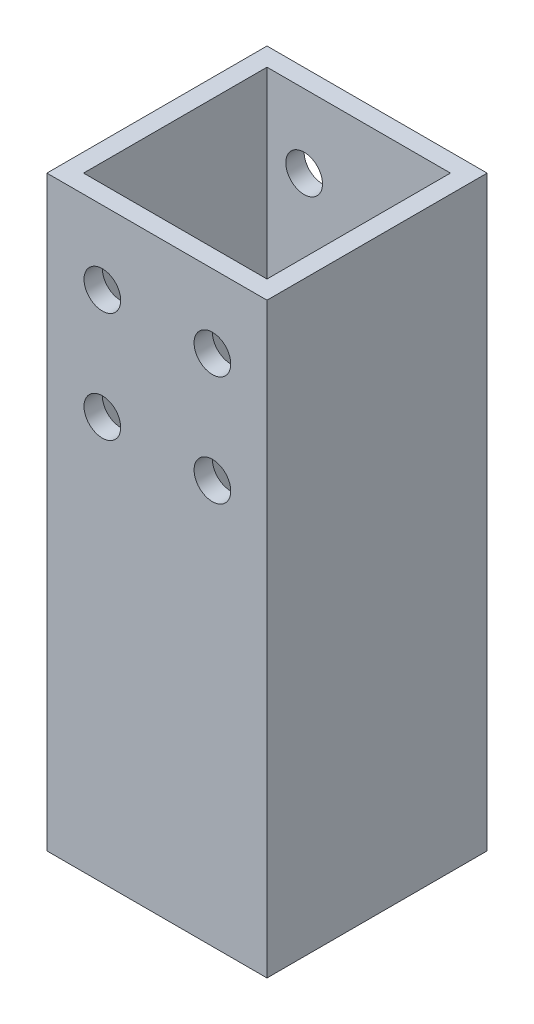
ISO-10303-21;
HEADER;
FILE_DESCRIPTION(('STEP AP214'),'2;1');
FILE_NAME('part.step','',(''),(''),'','','');
FILE_SCHEMA(('AUTOMOTIVE_DESIGN { 1 0 10303 214 1 1 1 1 }'));
ENDSEC;
DATA;
#1=APPLICATION_CONTEXT('core data for automotive mechanical design processes');
#2=APPLICATION_PROTOCOL_DEFINITION('international standard','automotive_design',2000,#1);
#3=PRODUCT_CONTEXT('',#1,'mechanical');
#4=PRODUCT('Part','Part','',(#3));
#5=PRODUCT_RELATED_PRODUCT_CATEGORY('part','',(#4));
#6=PRODUCT_DEFINITION_FORMATION('','',#4);
#7=PRODUCT_DEFINITION_CONTEXT('part definition',#1,'design');
#8=PRODUCT_DEFINITION('design','',#6,#7);
#9=PRODUCT_DEFINITION_SHAPE('','',#8);
#10=(LENGTH_UNIT() NAMED_UNIT(*) SI_UNIT(.MILLI.,.METRE.));
#11=(NAMED_UNIT(*) PLANE_ANGLE_UNIT() SI_UNIT($,.RADIAN.));
#12=(NAMED_UNIT(*) SI_UNIT($,.STERADIAN.) SOLID_ANGLE_UNIT());
#13=UNCERTAINTY_MEASURE_WITH_UNIT(LENGTH_MEASURE(1.E-05),#10,'distance_accuracy_value','');
#14=(GEOMETRIC_REPRESENTATION_CONTEXT(3) GLOBAL_UNCERTAINTY_ASSIGNED_CONTEXT((#13)) GLOBAL_UNIT_ASSIGNED_CONTEXT((#10,
#11,#12)) REPRESENTATION_CONTEXT('',''));
#15=CARTESIAN_POINT('',(0.,0.,0.));
#16=DIRECTION('',(0.,0.,1.));
#17=DIRECTION('',(1.,0.,0.));
#18=AXIS2_PLACEMENT_3D('',#15,#16,#17);
#19=CARTESIAN_POINT('',(0.,101.6,0.));
#20=DIRECTION('',(0.,-1.,0.));
#21=DIRECTION('',(0.,0.,-1.));
#22=AXIS2_PLACEMENT_3D('',#19,#20,#21);
#23=PLANE('',#22);
#24=DIRECTION('',(0.,0.,-1.));
#25=VECTOR('',#24,1.);
#26=CARTESIAN_POINT('',(19.05,101.6,19.05));
#27=LINE('',#26,#25);
#28=CARTESIAN_POINT('',(19.05,101.6,19.05));
#29=VERTEX_POINT('',#28);
#30=CARTESIAN_POINT('',(19.05,101.6,-19.05));
#31=VERTEX_POINT('',#30);
#32=EDGE_CURVE('E145',#29,#31,#27,.T.);
#33=ORIENTED_EDGE('',*,*,#32,.T.);
#34=DIRECTION('',(-1.,0.,0.));
#35=VECTOR('',#34,1.);
#36=CARTESIAN_POINT('',(-19.05,101.6,-19.05));
#37=LINE('',#36,#35);
#38=CARTESIAN_POINT('',(-19.05,101.6,-19.05));
#39=VERTEX_POINT('',#38);
#40=EDGE_CURVE('E148',#31,#39,#37,.T.);
#41=ORIENTED_EDGE('',*,*,#40,.T.);
#42=DIRECTION('',(0.,0.,1.));
#43=VECTOR('',#42,1.);
#44=CARTESIAN_POINT('',(-19.05,101.6,19.05));
#45=LINE('',#44,#43);
#46=CARTESIAN_POINT('',(-19.05,101.6,19.05));
#47=VERTEX_POINT('',#46);
#48=EDGE_CURVE('E151',#39,#47,#45,.T.);
#49=ORIENTED_EDGE('',*,*,#48,.T.);
#50=DIRECTION('',(1.,0.,0.));
#51=VECTOR('',#50,1.);
#52=CARTESIAN_POINT('',(-19.05,101.6,19.05));
#53=LINE('',#52,#51);
#54=EDGE_CURVE('E153',#47,#29,#53,.T.);
#55=ORIENTED_EDGE('',*,*,#54,.T.);
#56=EDGE_LOOP('',(#33,#41,#49,#55));
#57=FACE_BOUND('',#56,.T.);
#58=DIRECTION('',(0.,0.,-1.));
#59=VECTOR('',#58,1.);
#60=CARTESIAN_POINT('',(15.875,101.6,15.875));
#61=LINE('',#60,#59);
#62=CARTESIAN_POINT('',(15.875,101.6,15.875));
#63=VERTEX_POINT('',#62);
#64=CARTESIAN_POINT('',(15.875,101.6,-15.875));
#65=VERTEX_POINT('',#64);
#66=EDGE_CURVE('E107',#63,#65,#61,.T.);
#67=ORIENTED_EDGE('',*,*,#66,.F.);
#68=DIRECTION('',(1.,0.,0.));
#69=VECTOR('',#68,1.);
#70=CARTESIAN_POINT('',(-15.875,101.6,15.875));
#71=LINE('',#70,#69);
#72=CARTESIAN_POINT('',(-15.875,101.6,15.875));
#73=VERTEX_POINT('',#72);
#74=EDGE_CURVE('E129',#73,#63,#71,.T.);
#75=ORIENTED_EDGE('',*,*,#74,.F.);
#76=DIRECTION('',(0.,0.,1.));
#77=VECTOR('',#76,1.);
#78=CARTESIAN_POINT('',(-15.875,101.6,15.875));
#79=LINE('',#78,#77);
#80=CARTESIAN_POINT('',(-15.875,101.6,-15.875));
#81=VERTEX_POINT('',#80);
#82=EDGE_CURVE('E127',#81,#73,#79,.T.);
#83=ORIENTED_EDGE('',*,*,#82,.F.);
#84=DIRECTION('',(-1.,0.,0.));
#85=VECTOR('',#84,1.);
#86=CARTESIAN_POINT('',(-15.875,101.6,-15.875));
#87=LINE('',#86,#85);
#88=EDGE_CURVE('E115',#65,#81,#87,.T.);
#89=ORIENTED_EDGE('',*,*,#88,.F.);
#90=EDGE_LOOP('',(#67,#75,#83,#89));
#91=FACE_BOUND('',#90,.T.);
#92=ADVANCED_FACE('F41',(#57,#91),#23,.F.);
#93=CARTESIAN_POINT('',(0.,0.,0.));
#94=DIRECTION('',(0.,-1.,0.));
#95=DIRECTION('',(0.,0.,-1.));
#96=AXIS2_PLACEMENT_3D('',#93,#94,#95);
#97=PLANE('',#96);
#98=DIRECTION('',(0.,0.,-1.));
#99=VECTOR('',#98,1.);
#100=CARTESIAN_POINT('',(19.05,0.,19.05));
#101=LINE('',#100,#99);
#102=CARTESIAN_POINT('',(19.05,0.,19.05));
#103=VERTEX_POINT('',#102);
#104=CARTESIAN_POINT('',(19.05,0.,-19.05));
#105=VERTEX_POINT('',#104);
#106=EDGE_CURVE('E123',#103,#105,#101,.T.);
#107=ORIENTED_EDGE('',*,*,#106,.F.);
#108=DIRECTION('',(1.,0.,0.));
#109=VECTOR('',#108,1.);
#110=CARTESIAN_POINT('',(-19.05,0.,19.05));
#111=LINE('',#110,#109);
#112=CARTESIAN_POINT('',(-19.05,0.,19.05));
#113=VERTEX_POINT('',#112);
#114=EDGE_CURVE('E149',#113,#103,#111,.T.);
#115=ORIENTED_EDGE('',*,*,#114,.F.);
#116=DIRECTION('',(0.,0.,1.));
#117=VECTOR('',#116,1.);
#118=CARTESIAN_POINT('',(-19.05,0.,19.05));
#119=LINE('',#118,#117);
#120=CARTESIAN_POINT('',(-19.05,0.,-19.05));
#121=VERTEX_POINT('',#120);
#122=EDGE_CURVE('E160',#121,#113,#119,.T.);
#123=ORIENTED_EDGE('',*,*,#122,.F.);
#124=DIRECTION('',(-1.,0.,0.));
#125=VECTOR('',#124,1.);
#126=CARTESIAN_POINT('',(-19.05,0.,-19.05));
#127=LINE('',#126,#125);
#128=EDGE_CURVE('E158',#105,#121,#127,.T.);
#129=ORIENTED_EDGE('',*,*,#128,.F.);
#130=EDGE_LOOP('',(#107,#115,#123,#129));
#131=FACE_BOUND('',#130,.T.);
#132=DIRECTION('',(1.,0.,0.));
#133=VECTOR('',#132,1.);
#134=CARTESIAN_POINT('',(-15.875,0.,15.875));
#135=LINE('',#134,#133);
#136=CARTESIAN_POINT('',(-15.875,0.,15.875));
#137=VERTEX_POINT('',#136);
#138=CARTESIAN_POINT('',(15.875,0.,15.875));
#139=VERTEX_POINT('',#138);
#140=EDGE_CURVE('E116',#137,#139,#135,.T.);
#141=ORIENTED_EDGE('',*,*,#140,.T.);
#142=DIRECTION('',(0.,0.,-1.));
#143=VECTOR('',#142,1.);
#144=CARTESIAN_POINT('',(15.875,0.,15.875));
#145=LINE('',#144,#143);
#146=CARTESIAN_POINT('',(15.875,0.,-15.875));
#147=VERTEX_POINT('',#146);
#148=EDGE_CURVE('E65',#139,#147,#145,.T.);
#149=ORIENTED_EDGE('',*,*,#148,.T.);
#150=DIRECTION('',(-1.,0.,0.));
#151=VECTOR('',#150,1.);
#152=CARTESIAN_POINT('',(-15.875,0.,-15.875));
#153=LINE('',#152,#151);
#154=CARTESIAN_POINT('',(-15.875,0.,-15.875));
#155=VERTEX_POINT('',#154);
#156=EDGE_CURVE('E122',#147,#155,#153,.T.);
#157=ORIENTED_EDGE('',*,*,#156,.T.);
#158=DIRECTION('',(0.,0.,1.));
#159=VECTOR('',#158,1.);
#160=CARTESIAN_POINT('',(-15.875,0.,15.875));
#161=LINE('',#160,#159);
#162=EDGE_CURVE('E137',#155,#137,#161,.T.);
#163=ORIENTED_EDGE('',*,*,#162,.T.);
#164=EDGE_LOOP('',(#141,#149,#157,#163));
#165=FACE_BOUND('',#164,.T.);
#166=ADVANCED_FACE('F179',(#131,#165),#97,.T.);
#167=CARTESIAN_POINT('',(19.05,101.6,19.05));
#168=DIRECTION('',(-1.,0.,0.));
#169=DIRECTION('',(0.,0.,1.));
#170=AXIS2_PLACEMENT_3D('',#167,#168,#169);
#171=PLANE('',#170);
#172=ORIENTED_EDGE('',*,*,#106,.T.);
#173=DIRECTION('',(0.,-1.,0.));
#174=VECTOR('',#173,1.);
#175=CARTESIAN_POINT('',(19.05,101.6,-19.05));
#176=LINE('',#175,#174);
#177=EDGE_CURVE('E11',#31,#105,#176,.T.);
#178=ORIENTED_EDGE('',*,*,#177,.F.);
#179=ORIENTED_EDGE('',*,*,#32,.F.);
#180=DIRECTION('',(0.,-1.,0.));
#181=VECTOR('',#180,1.);
#182=CARTESIAN_POINT('',(19.05,101.6,19.05));
#183=LINE('',#182,#181);
#184=EDGE_CURVE('E155',#29,#103,#183,.T.);
#185=ORIENTED_EDGE('',*,*,#184,.T.);
#186=EDGE_LOOP('',(#172,#178,#179,#185));
#187=FACE_BOUND('',#186,.T.);
#188=ADVANCED_FACE('F43',(#187),#171,.F.);
#189=CARTESIAN_POINT('',(-19.05,101.6,-19.05));
#190=DIRECTION('',(0.,0.,1.));
#191=DIRECTION('',(1.,0.,0.));
#192=AXIS2_PLACEMENT_3D('',#189,#190,#191);
#193=PLANE('',#192);
#194=CARTESIAN_POINT('',(9.6012,88.9,-19.05));
#195=DIRECTION('',(0.,0.,1.));
#196=DIRECTION('',(1.,0.,0.));
#197=AXIS2_PLACEMENT_3D('',#194,#195,#196);
#198=CIRCLE('',#197,3.175);
#199=CARTESIAN_POINT('',(12.7762,88.9,-19.05));
#200=VERTEX_POINT('',#199);
#201=EDGE_CURVE('E287',#200,#200,#198,.T.);
#202=ORIENTED_EDGE('',*,*,#201,.T.);
#203=EDGE_LOOP('',(#202));
#204=FACE_BOUND('',#203,.T.);
#205=CARTESIAN_POINT('',(-9.4488,88.9,-19.05));
#206=DIRECTION('',(0.,0.,1.));
#207=DIRECTION('',(1.,0.,0.));
#208=AXIS2_PLACEMENT_3D('',#205,#206,#207);
#209=CIRCLE('',#208,3.175);
#210=CARTESIAN_POINT('',(-6.2738,88.9,-19.05));
#211=VERTEX_POINT('',#210);
#212=EDGE_CURVE('E282',#211,#211,#209,.T.);
#213=ORIENTED_EDGE('',*,*,#212,.T.);
#214=EDGE_LOOP('',(#213));
#215=FACE_BOUND('',#214,.T.);
#216=CARTESIAN_POINT('',(9.6012,69.85,-19.05));
#217=DIRECTION('',(0.,0.,1.));
#218=DIRECTION('',(1.,0.,0.));
#219=AXIS2_PLACEMENT_3D('',#216,#217,#218);
#220=CIRCLE('',#219,3.175);
#221=CARTESIAN_POINT('',(12.7762,69.85,-19.05));
#222=VERTEX_POINT('',#221);
#223=EDGE_CURVE('E231',#222,#222,#220,.T.);
#224=ORIENTED_EDGE('',*,*,#223,.T.);
#225=EDGE_LOOP('',(#224));
#226=FACE_BOUND('',#225,.T.);
#227=CARTESIAN_POINT('',(-9.4488,69.85,-19.05));
#228=DIRECTION('',(0.,0.,1.));
#229=DIRECTION('',(1.,0.,0.));
#230=AXIS2_PLACEMENT_3D('',#227,#228,#229);
#231=CIRCLE('',#230,3.175);
#232=CARTESIAN_POINT('',(-6.2738,69.85,-19.05));
#233=VERTEX_POINT('',#232);
#234=EDGE_CURVE('E135',#233,#233,#231,.T.);
#235=ORIENTED_EDGE('',*,*,#234,.T.);
#236=EDGE_LOOP('',(#235));
#237=FACE_BOUND('',#236,.T.);
#238=ORIENTED_EDGE('',*,*,#128,.T.);
#239=DIRECTION('',(0.,-1.,0.));
#240=VECTOR('',#239,1.);
#241=CARTESIAN_POINT('',(-19.05,101.6,-19.05));
#242=LINE('',#241,#240);
#243=EDGE_CURVE('E50',#39,#121,#242,.T.);
#244=ORIENTED_EDGE('',*,*,#243,.F.);
#245=ORIENTED_EDGE('',*,*,#40,.F.);
#246=ORIENTED_EDGE('',*,*,#177,.T.);
#247=EDGE_LOOP('',(#238,#244,#245,#246));
#248=FACE_BOUND('',#247,.T.);
#249=ADVANCED_FACE('F189',(#204,#215,#226,#237,#248),#193,.F.);
#250=CARTESIAN_POINT('',(-19.05,101.6,19.05));
#251=DIRECTION('',(1.,0.,0.));
#252=DIRECTION('',(0.,0.,-1.));
#253=AXIS2_PLACEMENT_3D('',#250,#251,#252);
#254=PLANE('',#253);
#255=ORIENTED_EDGE('',*,*,#122,.T.);
#256=DIRECTION('',(0.,-1.,0.));
#257=VECTOR('',#256,1.);
#258=CARTESIAN_POINT('',(-19.05,101.6,19.05));
#259=LINE('',#258,#257);
#260=EDGE_CURVE('E165',#47,#113,#259,.T.);
#261=ORIENTED_EDGE('',*,*,#260,.F.);
#262=ORIENTED_EDGE('',*,*,#48,.F.);
#263=ORIENTED_EDGE('',*,*,#243,.T.);
#264=EDGE_LOOP('',(#255,#261,#262,#263));
#265=FACE_BOUND('',#264,.T.);
#266=ADVANCED_FACE('F173',(#265),#254,.F.);
#267=CARTESIAN_POINT('',(-19.05,101.6,19.05));
#268=DIRECTION('',(0.,0.,-1.));
#269=DIRECTION('',(-1.,0.,0.));
#270=AXIS2_PLACEMENT_3D('',#267,#268,#269);
#271=PLANE('',#270);
#272=CARTESIAN_POINT('',(9.6012,88.9,19.05));
#273=DIRECTION('',(0.,0.,1.));
#274=DIRECTION('',(1.,0.,0.));
#275=AXIS2_PLACEMENT_3D('',#272,#273,#274);
#276=CIRCLE('',#275,3.175);
#277=CARTESIAN_POINT('',(12.7762,88.9,19.05));
#278=VERTEX_POINT('',#277);
#279=EDGE_CURVE('E218',#278,#278,#276,.T.);
#280=ORIENTED_EDGE('',*,*,#279,.F.);
#281=EDGE_LOOP('',(#280));
#282=FACE_BOUND('',#281,.T.);
#283=CARTESIAN_POINT('',(-9.4488,88.9,19.05));
#284=DIRECTION('',(0.,0.,1.));
#285=DIRECTION('',(1.,0.,0.));
#286=AXIS2_PLACEMENT_3D('',#283,#284,#285);
#287=CIRCLE('',#286,3.175);
#288=CARTESIAN_POINT('',(-6.2738,88.9,19.05));
#289=VERTEX_POINT('',#288);
#290=EDGE_CURVE('E222',#289,#289,#287,.T.);
#291=ORIENTED_EDGE('',*,*,#290,.F.);
#292=EDGE_LOOP('',(#291));
#293=FACE_BOUND('',#292,.T.);
#294=CARTESIAN_POINT('',(9.6012,69.85,19.05));
#295=DIRECTION('',(0.,0.,1.));
#296=DIRECTION('',(1.,0.,0.));
#297=AXIS2_PLACEMENT_3D('',#294,#295,#296);
#298=CIRCLE('',#297,3.175);
#299=CARTESIAN_POINT('',(12.7762,69.85,19.05));
#300=VERTEX_POINT('',#299);
#301=EDGE_CURVE('E226',#300,#300,#298,.T.);
#302=ORIENTED_EDGE('',*,*,#301,.F.);
#303=EDGE_LOOP('',(#302));
#304=FACE_BOUND('',#303,.T.);
#305=CARTESIAN_POINT('',(-9.4488,69.85,19.05));
#306=DIRECTION('',(0.,0.,1.));
#307=DIRECTION('',(1.,0.,0.));
#308=AXIS2_PLACEMENT_3D('',#305,#306,#307);
#309=CIRCLE('',#308,3.175);
#310=CARTESIAN_POINT('',(-6.2738,69.85,19.05));
#311=VERTEX_POINT('',#310);
#312=EDGE_CURVE('E229',#311,#311,#309,.T.);
#313=ORIENTED_EDGE('',*,*,#312,.F.);
#314=EDGE_LOOP('',(#313));
#315=FACE_BOUND('',#314,.T.);
#316=ORIENTED_EDGE('',*,*,#114,.T.);
#317=ORIENTED_EDGE('',*,*,#184,.F.);
#318=ORIENTED_EDGE('',*,*,#54,.F.);
#319=ORIENTED_EDGE('',*,*,#260,.T.);
#320=EDGE_LOOP('',(#316,#317,#318,#319));
#321=FACE_BOUND('',#320,.T.);
#322=ADVANCED_FACE('F183',(#282,#293,#304,#315,#321),#271,.F.);
#323=CARTESIAN_POINT('',(15.875,101.6,15.875));
#324=DIRECTION('',(-1.,0.,0.));
#325=DIRECTION('',(0.,0.,1.));
#326=AXIS2_PLACEMENT_3D('',#323,#324,#325);
#327=PLANE('',#326);
#328=ORIENTED_EDGE('',*,*,#148,.F.);
#329=DIRECTION('',(0.,-1.,0.));
#330=VECTOR('',#329,1.);
#331=CARTESIAN_POINT('',(15.875,101.6,15.875));
#332=LINE('',#331,#330);
#333=EDGE_CURVE('E111',#63,#139,#332,.T.);
#334=ORIENTED_EDGE('',*,*,#333,.F.);
#335=ORIENTED_EDGE('',*,*,#66,.T.);
#336=DIRECTION('',(0.,-1.,0.));
#337=VECTOR('',#336,1.);
#338=CARTESIAN_POINT('',(15.875,101.6,-15.875));
#339=LINE('',#338,#337);
#340=EDGE_CURVE('E110',#65,#147,#339,.T.);
#341=ORIENTED_EDGE('',*,*,#340,.T.);
#342=EDGE_LOOP('',(#328,#334,#335,#341));
#343=FACE_BOUND('',#342,.T.);
#344=ADVANCED_FACE('F109',(#343),#327,.T.);
#345=CARTESIAN_POINT('',(-15.875,101.6,-15.875));
#346=DIRECTION('',(0.,0.,1.));
#347=DIRECTION('',(1.,0.,0.));
#348=AXIS2_PLACEMENT_3D('',#345,#346,#347);
#349=PLANE('',#348);
#350=CARTESIAN_POINT('',(9.6012,88.9,-15.875));
#351=DIRECTION('',(0.,0.,1.));
#352=DIRECTION('',(1.,0.,0.));
#353=AXIS2_PLACEMENT_3D('',#350,#351,#352);
#354=CIRCLE('',#353,3.175);
#355=CARTESIAN_POINT('',(12.7762,88.9,-15.875));
#356=VERTEX_POINT('',#355);
#357=EDGE_CURVE('E273',#356,#356,#354,.T.);
#358=ORIENTED_EDGE('',*,*,#357,.F.);
#359=EDGE_LOOP('',(#358));
#360=FACE_BOUND('',#359,.T.);
#361=CARTESIAN_POINT('',(-9.4488,88.9,-15.875));
#362=DIRECTION('',(0.,0.,1.));
#363=DIRECTION('',(1.,0.,0.));
#364=AXIS2_PLACEMENT_3D('',#361,#362,#363);
#365=CIRCLE('',#364,3.175);
#366=CARTESIAN_POINT('',(-6.2738,88.9,-15.875));
#367=VERTEX_POINT('',#366);
#368=EDGE_CURVE('E277',#367,#367,#365,.T.);
#369=ORIENTED_EDGE('',*,*,#368,.F.);
#370=EDGE_LOOP('',(#369));
#371=FACE_BOUND('',#370,.T.);
#372=CARTESIAN_POINT('',(9.6012,69.85,-15.875));
#373=DIRECTION('',(0.,0.,1.));
#374=DIRECTION('',(1.,0.,0.));
#375=AXIS2_PLACEMENT_3D('',#372,#373,#374);
#376=CIRCLE('',#375,3.175);
#377=CARTESIAN_POINT('',(12.7762,69.85,-15.875));
#378=VERTEX_POINT('',#377);
#379=EDGE_CURVE('E236',#378,#378,#376,.T.);
#380=ORIENTED_EDGE('',*,*,#379,.F.);
#381=EDGE_LOOP('',(#380));
#382=FACE_BOUND('',#381,.T.);
#383=CARTESIAN_POINT('',(-9.4488,69.85,-15.875));
#384=DIRECTION('',(0.,0.,1.));
#385=DIRECTION('',(1.,0.,0.));
#386=AXIS2_PLACEMENT_3D('',#383,#384,#385);
#387=CIRCLE('',#386,3.175);
#388=CARTESIAN_POINT('',(-6.2738,69.85,-15.875));
#389=VERTEX_POINT('',#388);
#390=EDGE_CURVE('E234',#389,#389,#387,.T.);
#391=ORIENTED_EDGE('',*,*,#390,.F.);
#392=EDGE_LOOP('',(#391));
#393=FACE_BOUND('',#392,.T.);
#394=ORIENTED_EDGE('',*,*,#156,.F.);
#395=ORIENTED_EDGE('',*,*,#340,.F.);
#396=ORIENTED_EDGE('',*,*,#88,.T.);
#397=DIRECTION('',(0.,-1.,0.));
#398=VECTOR('',#397,1.);
#399=CARTESIAN_POINT('',(-15.875,101.6,-15.875));
#400=LINE('',#399,#398);
#401=EDGE_CURVE('E124',#81,#155,#400,.T.);
#402=ORIENTED_EDGE('',*,*,#401,.T.);
#403=EDGE_LOOP('',(#394,#395,#396,#402));
#404=FACE_BOUND('',#403,.T.);
#405=ADVANCED_FACE('F119',(#360,#371,#382,#393,#404),#349,.T.);
#406=CARTESIAN_POINT('',(-15.875,101.6,15.875));
#407=DIRECTION('',(1.,0.,0.));
#408=DIRECTION('',(0.,0.,-1.));
#409=AXIS2_PLACEMENT_3D('',#406,#407,#408);
#410=PLANE('',#409);
#411=ORIENTED_EDGE('',*,*,#162,.F.);
#412=ORIENTED_EDGE('',*,*,#401,.F.);
#413=ORIENTED_EDGE('',*,*,#82,.T.);
#414=DIRECTION('',(0.,-1.,0.));
#415=VECTOR('',#414,1.);
#416=CARTESIAN_POINT('',(-15.875,101.6,15.875));
#417=LINE('',#416,#415);
#418=EDGE_CURVE('E57',#73,#137,#417,.T.);
#419=ORIENTED_EDGE('',*,*,#418,.T.);
#420=EDGE_LOOP('',(#411,#412,#413,#419));
#421=FACE_BOUND('',#420,.T.);
#422=ADVANCED_FACE('F263',(#421),#410,.T.);
#423=CARTESIAN_POINT('',(-15.875,101.6,15.875));
#424=DIRECTION('',(0.,0.,-1.));
#425=DIRECTION('',(-1.,0.,0.));
#426=AXIS2_PLACEMENT_3D('',#423,#424,#425);
#427=PLANE('',#426);
#428=CARTESIAN_POINT('',(9.6012,88.9,15.875));
#429=DIRECTION('',(0.,0.,-1.));
#430=DIRECTION('',(-1.,0.,0.));
#431=AXIS2_PLACEMENT_3D('',#428,#429,#430);
#432=CIRCLE('',#431,3.175);
#433=CARTESIAN_POINT('',(6.4262,88.9,15.875));
#434=VERTEX_POINT('',#433);
#435=EDGE_CURVE('E299',#434,#434,#432,.T.);
#436=ORIENTED_EDGE('',*,*,#435,.F.);
#437=EDGE_LOOP('',(#436));
#438=FACE_BOUND('',#437,.T.);
#439=CARTESIAN_POINT('',(-9.4488,88.9,15.875));
#440=DIRECTION('',(0.,0.,-1.));
#441=DIRECTION('',(-1.,0.,0.));
#442=AXIS2_PLACEMENT_3D('',#439,#440,#441);
#443=CIRCLE('',#442,3.175);
#444=CARTESIAN_POINT('',(-12.6238,88.9,15.875));
#445=VERTEX_POINT('',#444);
#446=EDGE_CURVE('E295',#445,#445,#443,.T.);
#447=ORIENTED_EDGE('',*,*,#446,.F.);
#448=EDGE_LOOP('',(#447));
#449=FACE_BOUND('',#448,.T.);
#450=CARTESIAN_POINT('',(9.6012,69.85,15.875));
#451=DIRECTION('',(0.,0.,-1.));
#452=DIRECTION('',(-1.,0.,0.));
#453=AXIS2_PLACEMENT_3D('',#450,#451,#452);
#454=CIRCLE('',#453,3.175);
#455=CARTESIAN_POINT('',(6.4262,69.85,15.875));
#456=VERTEX_POINT('',#455);
#457=EDGE_CURVE('E291',#456,#456,#454,.T.);
#458=ORIENTED_EDGE('',*,*,#457,.F.);
#459=EDGE_LOOP('',(#458));
#460=FACE_BOUND('',#459,.T.);
#461=CARTESIAN_POINT('',(-9.4488,69.85,15.875));
#462=DIRECTION('',(0.,0.,-1.));
#463=DIRECTION('',(-1.,0.,0.));
#464=AXIS2_PLACEMENT_3D('',#461,#462,#463);
#465=CIRCLE('',#464,3.175);
#466=CARTESIAN_POINT('',(-12.6238,69.85,15.875));
#467=VERTEX_POINT('',#466);
#468=EDGE_CURVE('E45',#467,#467,#465,.T.);
#469=ORIENTED_EDGE('',*,*,#468,.F.);
#470=EDGE_LOOP('',(#469));
#471=FACE_BOUND('',#470,.T.);
#472=ORIENTED_EDGE('',*,*,#140,.F.);
#473=ORIENTED_EDGE('',*,*,#418,.F.);
#474=ORIENTED_EDGE('',*,*,#74,.T.);
#475=ORIENTED_EDGE('',*,*,#333,.T.);
#476=EDGE_LOOP('',(#472,#473,#474,#475));
#477=FACE_BOUND('',#476,.T.);
#478=ADVANCED_FACE('F257',(#438,#449,#460,#471,#477),#427,.T.);
#479=CARTESIAN_POINT('',(-9.4488,69.85,-82.55));
#480=DIRECTION('',(0.,0.,1.));
#481=DIRECTION('',(1.,0.,0.));
#482=AXIS2_PLACEMENT_3D('',#479,#480,#481);
#483=CYLINDRICAL_SURFACE('',#482,3.175);
#484=ORIENTED_EDGE('',*,*,#468,.T.);
#485=EDGE_LOOP('',(#484));
#486=FACE_BOUND('',#485,.T.);
#487=ORIENTED_EDGE('',*,*,#312,.T.);
#488=EDGE_LOOP('',(#487));
#489=FACE_BOUND('',#488,.T.);
#490=ADVANCED_FACE('F248',(#486,#489),#483,.F.);
#491=ORIENTED_EDGE('',*,*,#390,.T.);
#492=EDGE_LOOP('',(#491));
#493=FACE_BOUND('',#492,.T.);
#494=ORIENTED_EDGE('',*,*,#234,.F.);
#495=EDGE_LOOP('',(#494));
#496=FACE_BOUND('',#495,.T.);
#497=ADVANCED_FACE('F245',(#493,#496),#483,.F.);
#498=CARTESIAN_POINT('',(9.6012,69.85,-82.55));
#499=DIRECTION('',(0.,0.,1.));
#500=DIRECTION('',(1.,0.,0.));
#501=AXIS2_PLACEMENT_3D('',#498,#499,#500);
#502=CYLINDRICAL_SURFACE('',#501,3.175);
#503=ORIENTED_EDGE('',*,*,#379,.T.);
#504=EDGE_LOOP('',(#503));
#505=FACE_BOUND('',#504,.T.);
#506=ORIENTED_EDGE('',*,*,#223,.F.);
#507=EDGE_LOOP('',(#506));
#508=FACE_BOUND('',#507,.T.);
#509=ADVANCED_FACE('F247',(#505,#508),#502,.F.);
#510=CARTESIAN_POINT('',(-9.4488,88.9,-82.55));
#511=DIRECTION('',(0.,0.,1.));
#512=DIRECTION('',(1.,0.,0.));
#513=AXIS2_PLACEMENT_3D('',#510,#511,#512);
#514=CYLINDRICAL_SURFACE('',#513,3.175);
#515=ORIENTED_EDGE('',*,*,#368,.T.);
#516=EDGE_LOOP('',(#515));
#517=FACE_BOUND('',#516,.T.);
#518=ORIENTED_EDGE('',*,*,#212,.F.);
#519=EDGE_LOOP('',(#518));
#520=FACE_BOUND('',#519,.T.);
#521=ADVANCED_FACE('F254',(#517,#520),#514,.F.);
#522=CARTESIAN_POINT('',(9.6012,88.9,-82.55));
#523=DIRECTION('',(0.,0.,1.));
#524=DIRECTION('',(1.,0.,0.));
#525=AXIS2_PLACEMENT_3D('',#522,#523,#524);
#526=CYLINDRICAL_SURFACE('',#525,3.175);
#527=ORIENTED_EDGE('',*,*,#357,.T.);
#528=EDGE_LOOP('',(#527));
#529=FACE_BOUND('',#528,.T.);
#530=ORIENTED_EDGE('',*,*,#201,.F.);
#531=EDGE_LOOP('',(#530));
#532=FACE_BOUND('',#531,.T.);
#533=ADVANCED_FACE('F317',(#529,#532),#526,.F.);
#534=CARTESIAN_POINT('',(9.6012,69.85,-82.55));
#535=DIRECTION('',(0.,0.,1.));
#536=DIRECTION('',(1.,0.,0.));
#537=AXIS2_PLACEMENT_3D('',#534,#535,#536);
#538=CYLINDRICAL_SURFACE('',#537,3.175);
#539=ORIENTED_EDGE('',*,*,#457,.T.);
#540=EDGE_LOOP('',(#539));
#541=FACE_BOUND('',#540,.T.);
#542=ORIENTED_EDGE('',*,*,#301,.T.);
#543=EDGE_LOOP('',(#542));
#544=FACE_BOUND('',#543,.T.);
#545=ADVANCED_FACE('F313',(#541,#544),#538,.F.);
#546=CARTESIAN_POINT('',(-9.4488,88.9,-82.55));
#547=DIRECTION('',(0.,0.,1.));
#548=DIRECTION('',(1.,0.,0.));
#549=AXIS2_PLACEMENT_3D('',#546,#547,#548);
#550=CYLINDRICAL_SURFACE('',#549,3.175);
#551=ORIENTED_EDGE('',*,*,#446,.T.);
#552=EDGE_LOOP('',(#551));
#553=FACE_BOUND('',#552,.T.);
#554=ORIENTED_EDGE('',*,*,#290,.T.);
#555=EDGE_LOOP('',(#554));
#556=FACE_BOUND('',#555,.T.);
#557=ADVANCED_FACE('F316',(#553,#556),#550,.F.);
#558=CARTESIAN_POINT('',(9.6012,88.9,-82.55));
#559=DIRECTION('',(0.,0.,1.));
#560=DIRECTION('',(1.,0.,0.));
#561=AXIS2_PLACEMENT_3D('',#558,#559,#560);
#562=CYLINDRICAL_SURFACE('',#561,3.175);
#563=ORIENTED_EDGE('',*,*,#435,.T.);
#564=EDGE_LOOP('',(#563));
#565=FACE_BOUND('',#564,.T.);
#566=ORIENTED_EDGE('',*,*,#279,.T.);
#567=EDGE_LOOP('',(#566));
#568=FACE_BOUND('',#567,.T.);
#569=ADVANCED_FACE('F303',(#565,#568),#562,.F.);
#570=CLOSED_SHELL('',(#92,#166,#188,#249,#266,#322,#344,#405,#422,#478,#490,#497,#509,#521,#533,
#545,#557,#569));
#571=MANIFOLD_SOLID_BREP('B2',#570);
#572=ADVANCED_BREP_SHAPE_REPRESENTATION('',(#18,#571),#14);
#573=SHAPE_DEFINITION_REPRESENTATION(#9,#572);
ENDSEC;
END-ISO-10303-21;
